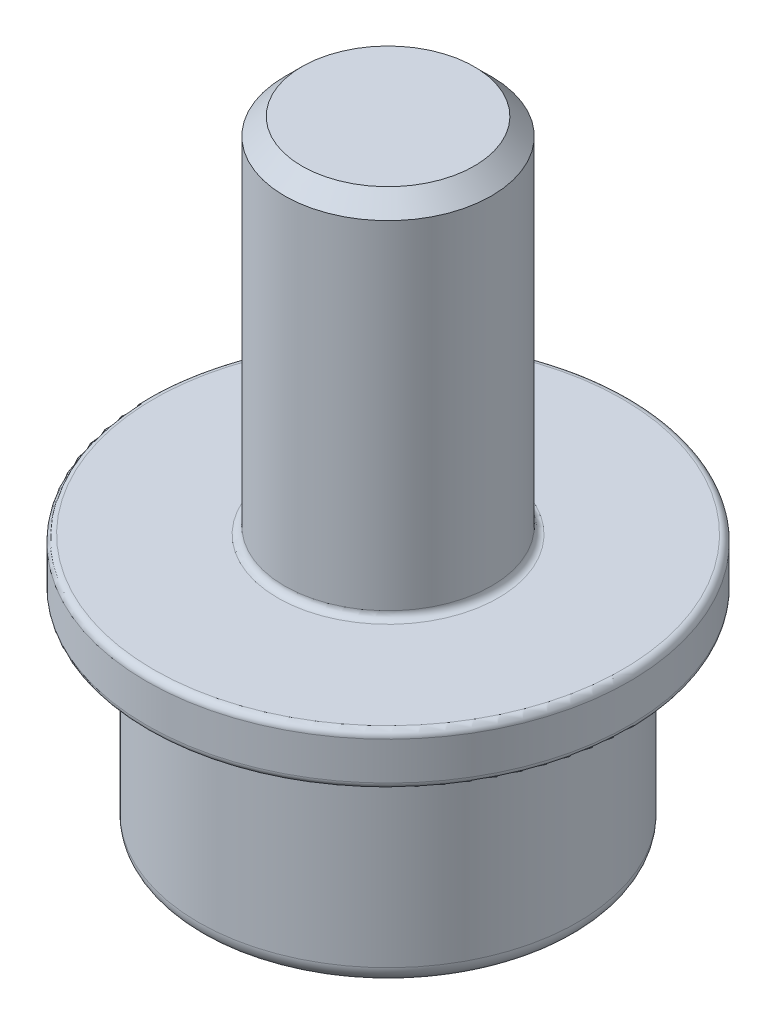
ISO-10303-21;
HEADER;
FILE_DESCRIPTION(('STEP AP214'),'2;1');
FILE_NAME('part.step','',(''),(''),'','','');
FILE_SCHEMA(('AUTOMOTIVE_DESIGN { 1 0 10303 214 1 1 1 1 }'));
ENDSEC;
DATA;
#1=APPLICATION_CONTEXT('core data for automotive mechanical design processes');
#2=APPLICATION_PROTOCOL_DEFINITION('international standard','automotive_design',2000,#1);
#3=PRODUCT_CONTEXT('',#1,'mechanical');
#4=PRODUCT('Part','Part','',(#3));
#5=PRODUCT_RELATED_PRODUCT_CATEGORY('part','',(#4));
#6=PRODUCT_DEFINITION_FORMATION('','',#4);
#7=PRODUCT_DEFINITION_CONTEXT('part definition',#1,'design');
#8=PRODUCT_DEFINITION('design','',#6,#7);
#9=PRODUCT_DEFINITION_SHAPE('','',#8);
#10=(LENGTH_UNIT() NAMED_UNIT(*) SI_UNIT(.MILLI.,.METRE.));
#11=(NAMED_UNIT(*) PLANE_ANGLE_UNIT() SI_UNIT($,.RADIAN.));
#12=(NAMED_UNIT(*) SI_UNIT($,.STERADIAN.) SOLID_ANGLE_UNIT());
#13=UNCERTAINTY_MEASURE_WITH_UNIT(LENGTH_MEASURE(1.E-05),#10,'distance_accuracy_value','');
#14=(GEOMETRIC_REPRESENTATION_CONTEXT(3) GLOBAL_UNCERTAINTY_ASSIGNED_CONTEXT((#13)) GLOBAL_UNIT_ASSIGNED_CONTEXT((#10,
#11,#12)) REPRESENTATION_CONTEXT('',''));
#15=CARTESIAN_POINT('',(0.,0.,0.));
#16=DIRECTION('',(0.,0.,1.));
#17=DIRECTION('',(1.,0.,0.));
#18=AXIS2_PLACEMENT_3D('',#15,#16,#17);
#19=CARTESIAN_POINT('',(0.,3.,0.));
#20=DIRECTION('',(0.,-1.,0.));
#21=DIRECTION('',(0.,0.,-1.));
#22=AXIS2_PLACEMENT_3D('',#19,#20,#21);
#23=CYLINDRICAL_SURFACE('',#22,2.75);
#24=CARTESIAN_POINT('',(0.,2.9,0.));
#25=DIRECTION('',(0.,1.,0.));
#26=DIRECTION('',(0.,0.,1.));
#27=AXIS2_PLACEMENT_3D('',#24,#25,#26);
#28=CIRCLE('',#27,2.75);
#29=CARTESIAN_POINT('',(0.,2.9,2.75));
#30=VERTEX_POINT('',#29);
#31=EDGE_CURVE('E201',#30,#30,#28,.F.);
#32=ORIENTED_EDGE('',*,*,#31,.T.);
#33=EDGE_LOOP('',(#32));
#34=FACE_BOUND('',#33,.T.);
#35=CARTESIAN_POINT('',(0.,0.25,0.));
#36=DIRECTION('',(0.,1.,0.));
#37=DIRECTION('',(0.,0.,1.));
#38=AXIS2_PLACEMENT_3D('',#35,#36,#37);
#39=CIRCLE('',#38,2.75);
#40=CARTESIAN_POINT('',(0.,0.25,2.75));
#41=VERTEX_POINT('',#40);
#42=EDGE_CURVE('E174',#41,#41,#39,.T.);
#43=ORIENTED_EDGE('',*,*,#42,.T.);
#44=EDGE_LOOP('',(#43));
#45=FACE_BOUND('',#44,.T.);
#46=ADVANCED_FACE('F33',(#34,#45),#23,.T.);
#47=CARTESIAN_POINT('',(0.,0.,0.));
#48=DIRECTION('',(0.,1.,0.));
#49=DIRECTION('',(0.,0.,1.));
#50=AXIS2_PLACEMENT_3D('',#47,#48,#49);
#51=PLANE('',#50);
#52=CARTESIAN_POINT('',(0.,0.,0.));
#53=DIRECTION('',(0.,1.,0.));
#54=DIRECTION('',(0.,0.,1.));
#55=AXIS2_PLACEMENT_3D('',#52,#53,#54);
#56=CIRCLE('',#55,2.5);
#57=CARTESIAN_POINT('',(0.,0.,2.5));
#58=VERTEX_POINT('',#57);
#59=EDGE_CURVE('E189',#58,#58,#56,.F.);
#60=ORIENTED_EDGE('',*,*,#59,.T.);
#61=EDGE_LOOP('',(#60));
#62=FACE_BOUND('',#61,.T.);
#63=DIRECTION('',(-0.69197693122312,0.,-0.721919612321922));
#64=VECTOR('',#63,1.);
#65=CARTESIAN_POINT('',(1.02450088015783,0.,-0.982008194523007));
#66=LINE('',#65,#64);
#67=CARTESIAN_POINT('',(1.59146357561211,0.,-0.390512335578876));
#68=VERTEX_POINT('',#67);
#69=CARTESIAN_POINT('',(0.457538184703553,0.,-1.57350405346714));
#70=VERTEX_POINT('',#69);
#71=EDGE_CURVE('E153',#68,#70,#66,.T.);
#72=ORIENTED_EDGE('',*,*,#71,.T.);
#73=DIRECTION('',(-0.971189189372558,0.,0.238309795111058));
#74=VECTOR('',#73,1.);
#75=CARTESIAN_POINT('',(-0.3381936031025,0.,-1.3782478856777));
#76=LINE('',#75,#74);
#77=CARTESIAN_POINT('',(-1.13392539090855,0.,-1.18299171788826));
#78=VERTEX_POINT('',#77);
#79=EDGE_CURVE('E163',#70,#78,#76,.T.);
#80=ORIENTED_EDGE('',*,*,#79,.T.);
#81=DIRECTION('',(-0.279212258149438,0.,0.96022940743298));
#82=VECTOR('',#81,1.);
#83=CARTESIAN_POINT('',(-1.36269448326033,0.,-0.396239691154693));
#84=LINE('',#83,#82);
#85=CARTESIAN_POINT('',(-1.5914635756121,0.,0.390512335578876));
#86=VERTEX_POINT('',#85);
#87=EDGE_CURVE('E161',#78,#86,#84,.T.);
#88=ORIENTED_EDGE('',*,*,#87,.T.);
#89=DIRECTION('',(0.69197693122312,0.,0.721919612321922));
#90=VECTOR('',#89,1.);
#91=CARTESIAN_POINT('',(-1.02450088015783,0.,0.982008194523007));
#92=LINE('',#91,#90);
#93=CARTESIAN_POINT('',(-0.457538184703552,0.,1.57350405346714));
#94=VERTEX_POINT('',#93);
#95=EDGE_CURVE('E159',#86,#94,#92,.T.);
#96=ORIENTED_EDGE('',*,*,#95,.T.);
#97=DIRECTION('',(0.971189189372558,0.,-0.238309795111058));
#98=VECTOR('',#97,1.);
#99=CARTESIAN_POINT('',(0.3381936031025,0.,1.3782478856777));
#100=LINE('',#99,#98);
#101=CARTESIAN_POINT('',(1.13392539090855,0.,1.18299171788826));
#102=VERTEX_POINT('',#101);
#103=EDGE_CURVE('E157',#94,#102,#100,.T.);
#104=ORIENTED_EDGE('',*,*,#103,.T.);
#105=DIRECTION('',(0.279212258149438,0.,-0.96022940743298));
#106=VECTOR('',#105,1.);
#107=CARTESIAN_POINT('',(1.36269448326033,0.,0.396239691154693));
#108=LINE('',#107,#106);
#109=EDGE_CURVE('E155',#102,#68,#108,.T.);
#110=ORIENTED_EDGE('',*,*,#109,.T.);
#111=EDGE_LOOP('',(#72,#80,#88,#96,#104,#110));
#112=FACE_BOUND('',#111,.T.);
#113=ADVANCED_FACE('F243',(#62,#112),#51,.F.);
#114=CARTESIAN_POINT('',(1.31110540565295,1.5,-0.321718223399928));
#115=DIRECTION('',(0.96022940743298,0.,0.279212258149438));
#116=DIRECTION('',(0.279212258149438,0.,-0.96022940743298));
#117=AXIS2_PLACEMENT_3D('',#114,#115,#116);
#118=PLANE('',#117);
#119=DIRECTION('',(0.,-1.,0.));
#120=VECTOR('',#119,1.);
#121=CARTESIAN_POINT('',(1.31110540565295,1.5,-0.321718223399928));
#122=LINE('',#121,#120);
#123=CARTESIAN_POINT('',(1.31110540565295,1.5,-0.321718223399928));
#124=VERTEX_POINT('',#123);
#125=CARTESIAN_POINT('',(1.31110540565295,0.250000000000002,-0.321718223399928));
#126=VERTEX_POINT('',#125);
#127=EDGE_CURVE('E139',#124,#126,#122,.T.);
#128=ORIENTED_EDGE('',*,*,#127,.T.);
#129=DIRECTION('',(-0.279212258149438,0.,0.96022940743298));
#130=VECTOR('',#129,1.);
#131=CARTESIAN_POINT('',(1.31110540565295,0.250000000000002,-0.321718223399928));
#132=LINE('',#131,#130);
#133=CARTESIAN_POINT('',(0.934168857151212,0.250000000000002,0.974591476634595));
#134=VERTEX_POINT('',#133);
#135=EDGE_CURVE('E55',#126,#134,#132,.T.);
#136=ORIENTED_EDGE('',*,*,#135,.T.);
#137=DIRECTION('',(0.,-1.,0.));
#138=VECTOR('',#137,1.);
#139=CARTESIAN_POINT('',(0.934168857151212,1.5,0.974591476634595));
#140=LINE('',#139,#138);
#141=CARTESIAN_POINT('',(0.934168857151212,1.5,0.974591476634595));
#142=VERTEX_POINT('',#141);
#143=EDGE_CURVE('E103',#142,#134,#140,.T.);
#144=ORIENTED_EDGE('',*,*,#143,.F.);
#145=DIRECTION('',(-0.279212258149438,0.,0.96022940743298));
#146=VECTOR('',#145,1.);
#147=CARTESIAN_POINT('',(1.31110540565295,1.5,-0.321718223399928));
#148=LINE('',#147,#146);
#149=EDGE_CURVE('E107',#124,#142,#148,.T.);
#150=ORIENTED_EDGE('',*,*,#149,.F.);
#151=EDGE_LOOP('',(#128,#136,#144,#150));
#152=FACE_BOUND('',#151,.T.);
#153=ADVANCED_FACE('F105',(#152),#118,.F.);
#154=CARTESIAN_POINT('',(0.376936548501741,1.5,-1.29630970003452));
#155=DIRECTION('',(0.721919612321922,0.,-0.69197693122312));
#156=DIRECTION('',(-0.69197693122312,0.,-0.721919612321922));
#157=AXIS2_PLACEMENT_3D('',#154,#155,#156);
#158=PLANE('',#157);
#159=DIRECTION('',(0.,-1.,0.));
#160=VECTOR('',#159,1.);
#161=CARTESIAN_POINT('',(0.376936548501741,1.5,-1.29630970003452));
#162=LINE('',#161,#160);
#163=CARTESIAN_POINT('',(0.376936548501741,1.5,-1.29630970003452));
#164=VERTEX_POINT('',#163);
#165=CARTESIAN_POINT('',(0.376936548501741,0.250000000000002,-1.29630970003452));
#166=VERTEX_POINT('',#165);
#167=EDGE_CURVE('E142',#164,#166,#162,.T.);
#168=ORIENTED_EDGE('',*,*,#167,.T.);
#169=DIRECTION('',(0.69197693122312,0.,0.721919612321922));
#170=VECTOR('',#169,1.);
#171=CARTESIAN_POINT('',(0.376936548501741,0.250000000000002,-1.29630970003452));
#172=LINE('',#171,#170);
#173=EDGE_CURVE('E48',#166,#126,#172,.T.);
#174=ORIENTED_EDGE('',*,*,#173,.T.);
#175=ORIENTED_EDGE('',*,*,#127,.F.);
#176=DIRECTION('',(0.69197693122312,0.,0.721919612321922));
#177=VECTOR('',#176,1.);
#178=CARTESIAN_POINT('',(0.376936548501741,1.5,-1.29630970003452));
#179=LINE('',#178,#177);
#180=EDGE_CURVE('E112',#164,#124,#179,.T.);
#181=ORIENTED_EDGE('',*,*,#180,.F.);
#182=EDGE_LOOP('',(#168,#174,#175,#181));
#183=FACE_BOUND('',#182,.T.);
#184=ADVANCED_FACE('F311',(#183),#158,.F.);
#185=CARTESIAN_POINT('',(-0.934168857151211,1.5,-0.974591476634595));
#186=DIRECTION('',(-0.238309795111058,0.,-0.971189189372557));
#187=DIRECTION('',(-0.971189189372558,0.,0.238309795111058));
#188=AXIS2_PLACEMENT_3D('',#185,#186,#187);
#189=PLANE('',#188);
#190=DIRECTION('',(0.,-1.,0.));
#191=VECTOR('',#190,1.);
#192=CARTESIAN_POINT('',(-0.934168857151211,1.5,-0.974591476634595));
#193=LINE('',#192,#191);
#194=CARTESIAN_POINT('',(-0.934168857151211,1.5,-0.974591476634595));
#195=VERTEX_POINT('',#194);
#196=CARTESIAN_POINT('',(-0.934168857151211,0.250000000000002,-0.974591476634595));
#197=VERTEX_POINT('',#196);
#198=EDGE_CURVE('E144',#195,#197,#193,.T.);
#199=ORIENTED_EDGE('',*,*,#198,.T.);
#200=DIRECTION('',(0.971189189372558,0.,-0.238309795111058));
#201=VECTOR('',#200,1.);
#202=CARTESIAN_POINT('',(-0.934168857151211,0.250000000000002,-0.974591476634595));
#203=LINE('',#202,#201);
#204=EDGE_CURVE('E141',#197,#166,#203,.T.);
#205=ORIENTED_EDGE('',*,*,#204,.T.);
#206=ORIENTED_EDGE('',*,*,#167,.F.);
#207=DIRECTION('',(0.971189189372558,0.,-0.238309795111058));
#208=VECTOR('',#207,1.);
#209=CARTESIAN_POINT('',(-0.934168857151211,1.5,-0.974591476634595));
#210=LINE('',#209,#208);
#211=EDGE_CURVE('E136',#195,#164,#210,.T.);
#212=ORIENTED_EDGE('',*,*,#211,.F.);
#213=EDGE_LOOP('',(#199,#205,#206,#212));
#214=FACE_BOUND('',#213,.T.);
#215=ADVANCED_FACE('F321',(#214),#189,.F.);
#216=CARTESIAN_POINT('',(-1.31110540565295,1.5,0.321718223399928));
#217=DIRECTION('',(-0.96022940743298,0.,-0.279212258149438));
#218=DIRECTION('',(-0.279212258149438,0.,0.96022940743298));
#219=AXIS2_PLACEMENT_3D('',#216,#217,#218);
#220=PLANE('',#219);
#221=DIRECTION('',(0.,-1.,0.));
#222=VECTOR('',#221,1.);
#223=CARTESIAN_POINT('',(-1.31110540565295,1.5,0.321718223399928));
#224=LINE('',#223,#222);
#225=CARTESIAN_POINT('',(-1.31110540565295,1.5,0.321718223399928));
#226=VERTEX_POINT('',#225);
#227=CARTESIAN_POINT('',(-1.31110540565295,0.250000000000002,0.321718223399928));
#228=VERTEX_POINT('',#227);
#229=EDGE_CURVE('E147',#226,#228,#224,.T.);
#230=ORIENTED_EDGE('',*,*,#229,.T.);
#231=DIRECTION('',(0.279212258149438,0.,-0.96022940743298));
#232=VECTOR('',#231,1.);
#233=CARTESIAN_POINT('',(-1.31110540565295,0.250000000000002,0.321718223399928));
#234=LINE('',#233,#232);
#235=EDGE_CURVE('E166',#228,#197,#234,.T.);
#236=ORIENTED_EDGE('',*,*,#235,.T.);
#237=ORIENTED_EDGE('',*,*,#198,.F.);
#238=DIRECTION('',(0.279212258149438,0.,-0.96022940743298));
#239=VECTOR('',#238,1.);
#240=CARTESIAN_POINT('',(-1.31110540565295,1.5,0.321718223399928));
#241=LINE('',#240,#239);
#242=EDGE_CURVE('E133',#226,#195,#241,.T.);
#243=ORIENTED_EDGE('',*,*,#242,.F.);
#244=EDGE_LOOP('',(#230,#236,#237,#243));
#245=FACE_BOUND('',#244,.T.);
#246=ADVANCED_FACE('F317',(#245),#220,.F.);
#247=CARTESIAN_POINT('',(-0.376936548501741,1.5,1.29630970003452));
#248=DIRECTION('',(-0.721919612321922,0.,0.69197693122312));
#249=DIRECTION('',(0.69197693122312,0.,0.721919612321922));
#250=AXIS2_PLACEMENT_3D('',#247,#248,#249);
#251=PLANE('',#250);
#252=DIRECTION('',(0.,-1.,0.));
#253=VECTOR('',#252,1.);
#254=CARTESIAN_POINT('',(-0.376936548501741,1.5,1.29630970003452));
#255=LINE('',#254,#253);
#256=CARTESIAN_POINT('',(-0.376936548501741,1.5,1.29630970003452));
#257=VERTEX_POINT('',#256);
#258=CARTESIAN_POINT('',(-0.376936548501741,0.250000000000002,1.29630970003452));
#259=VERTEX_POINT('',#258);
#260=EDGE_CURVE('E111',#257,#259,#255,.T.);
#261=ORIENTED_EDGE('',*,*,#260,.T.);
#262=DIRECTION('',(-0.69197693122312,0.,-0.721919612321922));
#263=VECTOR('',#262,1.);
#264=CARTESIAN_POINT('',(-0.376936548501741,0.250000000000002,1.29630970003452));
#265=LINE('',#264,#263);
#266=EDGE_CURVE('E168',#259,#228,#265,.T.);
#267=ORIENTED_EDGE('',*,*,#266,.T.);
#268=ORIENTED_EDGE('',*,*,#229,.F.);
#269=DIRECTION('',(-0.69197693122312,0.,-0.721919612321922));
#270=VECTOR('',#269,1.);
#271=CARTESIAN_POINT('',(-0.376936548501741,1.5,1.29630970003452));
#272=LINE('',#271,#270);
#273=EDGE_CURVE('E121',#257,#226,#272,.T.);
#274=ORIENTED_EDGE('',*,*,#273,.F.);
#275=EDGE_LOOP('',(#261,#267,#268,#274));
#276=FACE_BOUND('',#275,.T.);
#277=ADVANCED_FACE('F314',(#276),#251,.F.);
#278=CARTESIAN_POINT('',(0.934168857151212,1.5,0.974591476634595));
#279=DIRECTION('',(0.238309795111058,0.,0.971189189372558));
#280=DIRECTION('',(0.971189189372558,0.,-0.238309795111058));
#281=AXIS2_PLACEMENT_3D('',#278,#279,#280);
#282=PLANE('',#281);
#283=ORIENTED_EDGE('',*,*,#143,.T.);
#284=DIRECTION('',(-0.971189189372558,0.,0.238309795111058));
#285=VECTOR('',#284,1.);
#286=CARTESIAN_POINT('',(0.934168857151212,0.250000000000002,0.974591476634595));
#287=LINE('',#286,#285);
#288=EDGE_CURVE('E170',#134,#259,#287,.T.);
#289=ORIENTED_EDGE('',*,*,#288,.T.);
#290=ORIENTED_EDGE('',*,*,#260,.F.);
#291=DIRECTION('',(-0.971189189372557,0.,0.238309795111058));
#292=VECTOR('',#291,1.);
#293=CARTESIAN_POINT('',(0.934168857151212,1.5,0.974591476634595));
#294=LINE('',#293,#292);
#295=EDGE_CURVE('E115',#142,#257,#294,.T.);
#296=ORIENTED_EDGE('',*,*,#295,.F.);
#297=EDGE_LOOP('',(#283,#289,#290,#296));
#298=FACE_BOUND('',#297,.T.);
#299=ADVANCED_FACE('F116',(#298),#282,.F.);
#300=CARTESIAN_POINT('',(0.,1.5,0.));
#301=DIRECTION('',(0.,-1.,0.));
#302=DIRECTION('',(0.,0.,-1.));
#303=AXIS2_PLACEMENT_3D('',#300,#301,#302);
#304=PLANE('',#303);
#305=ORIENTED_EDGE('',*,*,#149,.T.);
#306=ORIENTED_EDGE('',*,*,#295,.T.);
#307=ORIENTED_EDGE('',*,*,#273,.T.);
#308=ORIENTED_EDGE('',*,*,#242,.T.);
#309=ORIENTED_EDGE('',*,*,#211,.T.);
#310=ORIENTED_EDGE('',*,*,#180,.T.);
#311=EDGE_LOOP('',(#305,#306,#307,#308,#309,#310));
#312=FACE_BOUND('',#311,.T.);
#313=ADVANCED_FACE('F123',(#312),#304,.T.);
#314=CARTESIAN_POINT('',(0.934168857151212,0.250000000000002,0.974591476634595));
#315=DIRECTION('',(0.168510472146206,0.707106781186547,0.686734461620402));
#316=DIRECTION('',(-0.971189189372558,0.,0.238309795111058));
#317=AXIS2_PLACEMENT_3D('',#314,#315,#316);
#318=PLANE('',#317);
#319=DIRECTION('',(-0.523085392288577,0.654653670707978,-0.545719931652561));
#320=VECTOR('',#319,1.);
#321=CARTESIAN_POINT('',(0.934168857151212,0.250000000000002,0.974591476634595));
#322=LINE('',#321,#320);
#323=EDGE_CURVE('E129',#102,#134,#322,.T.);
#324=ORIENTED_EDGE('',*,*,#323,.F.);
#325=ORIENTED_EDGE('',*,*,#103,.F.);
#326=DIRECTION('',(0.211064628018337,0.654653670707978,-0.725865203896737));
#327=VECTOR('',#326,1.);
#328=CARTESIAN_POINT('',(-0.376936548501741,0.250000000000002,1.29630970003452));
#329=LINE('',#328,#327);
#330=EDGE_CURVE('E126',#259,#94,#329,.F.);
#331=ORIENTED_EDGE('',*,*,#330,.F.);
#332=ORIENTED_EDGE('',*,*,#288,.F.);
#333=EDGE_LOOP('',(#324,#325,#331,#332));
#334=FACE_BOUND('',#333,.T.);
#335=ADVANCED_FACE('F273',(#334),#318,.F.);
#336=CARTESIAN_POINT('',(-0.376936548501741,0.250000000000002,1.29630970003452));
#337=DIRECTION('',(-0.510474253344395,0.707106781186547,0.489301580492525));
#338=DIRECTION('',(-0.69197693122312,0.,-0.721919612321922));
#339=AXIS2_PLACEMENT_3D('',#336,#337,#338);
#340=PLANE('',#339);
#341=ORIENTED_EDGE('',*,*,#330,.T.);
#342=ORIENTED_EDGE('',*,*,#95,.F.);
#343=DIRECTION('',(0.734150020306914,0.654653670707978,-0.180145272244176));
#344=VECTOR('',#343,1.);
#345=CARTESIAN_POINT('',(-1.31110540565295,0.250000000000002,0.321718223399928));
#346=LINE('',#345,#344);
#347=EDGE_CURVE('E182',#228,#86,#346,.F.);
#348=ORIENTED_EDGE('',*,*,#347,.F.);
#349=ORIENTED_EDGE('',*,*,#266,.F.);
#350=EDGE_LOOP('',(#341,#342,#348,#349));
#351=FACE_BOUND('',#350,.T.);
#352=ADVANCED_FACE('F269',(#351),#340,.F.);
#353=CARTESIAN_POINT('',(1.31110540565295,0.250000000000002,-0.321718223399928));
#354=DIRECTION('',(0.678984725490601,0.707106781186547,0.197432881127877));
#355=DIRECTION('',(-0.279212258149438,0.,0.96022940743298));
#356=AXIS2_PLACEMENT_3D('',#353,#354,#355);
#357=PLANE('',#356);
#358=ORIENTED_EDGE('',*,*,#323,.T.);
#359=ORIENTED_EDGE('',*,*,#135,.F.);
#360=DIRECTION('',(-0.734150020306914,0.654653670707978,0.180145272244176));
#361=VECTOR('',#360,1.);
#362=CARTESIAN_POINT('',(1.31110540565295,0.250000000000002,-0.321718223399928));
#363=LINE('',#362,#361);
#364=EDGE_CURVE('E179',#68,#126,#363,.T.);
#365=ORIENTED_EDGE('',*,*,#364,.F.);
#366=ORIENTED_EDGE('',*,*,#109,.F.);
#367=EDGE_LOOP('',(#358,#359,#365,#366));
#368=FACE_BOUND('',#367,.T.);
#369=ADVANCED_FACE('F265',(#368),#357,.F.);
#370=CARTESIAN_POINT('',(-1.31110540565295,0.250000000000002,0.321718223399928));
#371=DIRECTION('',(-0.678984725490601,0.707106781186547,-0.197432881127877));
#372=DIRECTION('',(0.279212258149438,0.,-0.96022940743298));
#373=AXIS2_PLACEMENT_3D('',#370,#371,#372);
#374=PLANE('',#373);
#375=ORIENTED_EDGE('',*,*,#347,.T.);
#376=ORIENTED_EDGE('',*,*,#87,.F.);
#377=DIRECTION('',(0.523085392288577,0.654653670707978,0.545719931652561));
#378=VECTOR('',#377,1.);
#379=CARTESIAN_POINT('',(-0.934168857151211,0.250000000000002,-0.974591476634595));
#380=LINE('',#379,#378);
#381=EDGE_CURVE('E177',#197,#78,#380,.F.);
#382=ORIENTED_EDGE('',*,*,#381,.F.);
#383=ORIENTED_EDGE('',*,*,#235,.F.);
#384=EDGE_LOOP('',(#375,#376,#382,#383));
#385=FACE_BOUND('',#384,.T.);
#386=ADVANCED_FACE('F261',(#385),#374,.F.);
#387=CARTESIAN_POINT('',(0.376936548501741,0.250000000000002,-1.29630970003452));
#388=DIRECTION('',(0.510474253344395,0.707106781186547,-0.489301580492525));
#389=DIRECTION('',(0.69197693122312,0.,0.721919612321922));
#390=AXIS2_PLACEMENT_3D('',#387,#388,#389);
#391=PLANE('',#390);
#392=ORIENTED_EDGE('',*,*,#364,.T.);
#393=ORIENTED_EDGE('',*,*,#173,.F.);
#394=DIRECTION('',(0.211064628018338,-0.654653670707978,-0.725865203896737));
#395=VECTOR('',#394,1.);
#396=CARTESIAN_POINT('',(0.269240391786958,0.584038370031143,-0.92593550002466));
#397=LINE('',#396,#395);
#398=EDGE_CURVE('E175',#70,#166,#397,.F.);
#399=ORIENTED_EDGE('',*,*,#398,.F.);
#400=ORIENTED_EDGE('',*,*,#71,.F.);
#401=EDGE_LOOP('',(#392,#393,#399,#400));
#402=FACE_BOUND('',#401,.T.);
#403=ADVANCED_FACE('F257',(#402),#391,.F.);
#404=CARTESIAN_POINT('',(-0.934168857151211,0.250000000000002,-0.974591476634595));
#405=DIRECTION('',(-0.168510472146206,0.707106781186547,-0.686734461620402));
#406=DIRECTION('',(0.971189189372558,0.,-0.238309795111058));
#407=AXIS2_PLACEMENT_3D('',#404,#405,#406);
#408=PLANE('',#407);
#409=ORIENTED_EDGE('',*,*,#381,.T.);
#410=ORIENTED_EDGE('',*,*,#79,.F.);
#411=ORIENTED_EDGE('',*,*,#398,.T.);
#412=ORIENTED_EDGE('',*,*,#204,.F.);
#413=EDGE_LOOP('',(#409,#410,#411,#412));
#414=FACE_BOUND('',#413,.T.);
#415=ADVANCED_FACE('F254',(#414),#408,.F.);
#416=CARTESIAN_POINT('',(0.,0.25,0.));
#417=DIRECTION('',(0.,1.,0.));
#418=DIRECTION('',(0.,0.,1.));
#419=AXIS2_PLACEMENT_3D('',#416,#417,#418);
#420=TOROIDAL_SURFACE('',#419,2.5,0.25);
#421=ORIENTED_EDGE('',*,*,#59,.F.);
#422=EDGE_LOOP('',(#421));
#423=FACE_BOUND('',#422,.T.);
#424=ORIENTED_EDGE('',*,*,#42,.F.);
#425=EDGE_LOOP('',(#424));
#426=FACE_BOUND('',#425,.T.);
#427=ADVANCED_FACE('F239',(#423,#426),#420,.T.);
#428=CARTESIAN_POINT('',(0.,2.9,0.));
#429=DIRECTION('',(0.,1.,0.));
#430=DIRECTION('',(0.,0.,1.));
#431=AXIS2_PLACEMENT_3D('',#428,#429,#430);
#432=TOROIDAL_SURFACE('',#431,2.65,0.1);
#433=ORIENTED_EDGE('',*,*,#31,.F.);
#434=EDGE_LOOP('',(#433));
#435=FACE_BOUND('',#434,.T.);
#436=CARTESIAN_POINT('',(0.,3.,0.));
#437=DIRECTION('',(0.,1.,0.));
#438=DIRECTION('',(0.,0.,1.));
#439=AXIS2_PLACEMENT_3D('',#436,#437,#438);
#440=CIRCLE('',#439,2.65);
#441=CARTESIAN_POINT('',(0.,3.,2.65));
#442=VERTEX_POINT('',#441);
#443=EDGE_CURVE('E198',#442,#442,#440,.T.);
#444=ORIENTED_EDGE('',*,*,#443,.F.);
#445=EDGE_LOOP('',(#444));
#446=FACE_BOUND('',#445,.T.);
#447=ADVANCED_FACE('F230',(#435,#446),#432,.T.);
#448=CARTESIAN_POINT('',(0.,3.75,0.));
#449=DIRECTION('',(0.,1.,0.));
#450=DIRECTION('',(0.,0.,1.));
#451=AXIS2_PLACEMENT_3D('',#448,#449,#450);
#452=PLANE('',#451);
#453=CARTESIAN_POINT('',(0.,3.75,0.));
#454=DIRECTION('',(0.,1.,0.));
#455=DIRECTION('',(0.,0.,1.));
#456=AXIS2_PLACEMENT_3D('',#453,#454,#455);
#457=CIRCLE('',#456,1.6);
#458=CARTESIAN_POINT('',(0.,3.75,1.6));
#459=VERTEX_POINT('',#458);
#460=EDGE_CURVE('E210',#459,#459,#457,.F.);
#461=ORIENTED_EDGE('',*,*,#460,.T.);
#462=EDGE_LOOP('',(#461));
#463=FACE_BOUND('',#462,.T.);
#464=CARTESIAN_POINT('',(0.,3.75,0.));
#465=DIRECTION('',(0.,1.,0.));
#466=DIRECTION('',(0.,0.,1.));
#467=AXIS2_PLACEMENT_3D('',#464,#465,#466);
#468=CIRCLE('',#467,3.4);
#469=CARTESIAN_POINT('',(0.,3.75,3.4));
#470=VERTEX_POINT('',#469);
#471=EDGE_CURVE('E207',#470,#470,#468,.T.);
#472=ORIENTED_EDGE('',*,*,#471,.T.);
#473=EDGE_LOOP('',(#472));
#474=FACE_BOUND('',#473,.T.);
#475=ADVANCED_FACE('F227',(#463,#474),#452,.T.);
#476=CARTESIAN_POINT('',(0.,3.,0.));
#477=DIRECTION('',(0.,1.,0.));
#478=DIRECTION('',(0.,0.,1.));
#479=AXIS2_PLACEMENT_3D('',#476,#477,#478);
#480=PLANE('',#479);
#481=CARTESIAN_POINT('',(0.,3.,0.));
#482=DIRECTION('',(0.,1.,0.));
#483=DIRECTION('',(0.,0.,1.));
#484=AXIS2_PLACEMENT_3D('',#481,#482,#483);
#485=CIRCLE('',#484,3.4);
#486=CARTESIAN_POINT('',(0.,3.,3.4));
#487=VERTEX_POINT('',#486);
#488=EDGE_CURVE('E11',#487,#487,#485,.F.);
#489=ORIENTED_EDGE('',*,*,#488,.T.);
#490=EDGE_LOOP('',(#489));
#491=FACE_BOUND('',#490,.T.);
#492=ORIENTED_EDGE('',*,*,#443,.T.);
#493=EDGE_LOOP('',(#492));
#494=FACE_BOUND('',#493,.T.);
#495=ADVANCED_FACE('F229',(#491,#494),#480,.F.);
#496=CARTESIAN_POINT('',(0.,3.75,0.));
#497=DIRECTION('',(0.,-1.,0.));
#498=DIRECTION('',(0.,0.,-1.));
#499=AXIS2_PLACEMENT_3D('',#496,#497,#498);
#500=CYLINDRICAL_SURFACE('',#499,3.5);
#501=CARTESIAN_POINT('',(0.,3.65,0.));
#502=DIRECTION('',(0.,1.,0.));
#503=DIRECTION('',(0.,0.,1.));
#504=AXIS2_PLACEMENT_3D('',#501,#502,#503);
#505=CIRCLE('',#504,3.5);
#506=CARTESIAN_POINT('',(0.,3.65,3.5));
#507=VERTEX_POINT('',#506);
#508=EDGE_CURVE('E41',#507,#507,#505,.F.);
#509=ORIENTED_EDGE('',*,*,#508,.T.);
#510=EDGE_LOOP('',(#509));
#511=FACE_BOUND('',#510,.T.);
#512=CARTESIAN_POINT('',(0.,3.1,0.));
#513=DIRECTION('',(0.,1.,0.));
#514=DIRECTION('',(0.,0.,1.));
#515=AXIS2_PLACEMENT_3D('',#512,#513,#514);
#516=CIRCLE('',#515,3.5);
#517=CARTESIAN_POINT('',(0.,3.1,3.5));
#518=VERTEX_POINT('',#517);
#519=EDGE_CURVE('E213',#518,#518,#516,.T.);
#520=ORIENTED_EDGE('',*,*,#519,.T.);
#521=EDGE_LOOP('',(#520));
#522=FACE_BOUND('',#521,.T.);
#523=ADVANCED_FACE('F218',(#511,#522),#500,.T.);
#524=CARTESIAN_POINT('',(0.,9.,0.));
#525=DIRECTION('',(0.,1.,0.));
#526=DIRECTION('',(0.,0.,1.));
#527=AXIS2_PLACEMENT_3D('',#524,#525,#526);
#528=PLANE('',#527);
#529=CARTESIAN_POINT('',(0.,9.,0.));
#530=DIRECTION('',(0.,1.,0.));
#531=DIRECTION('',(0.,0.,1.));
#532=AXIS2_PLACEMENT_3D('',#529,#530,#531);
#533=CIRCLE('',#532,1.25);
#534=CARTESIAN_POINT('',(0.,9.,1.25));
#535=VERTEX_POINT('',#534);
#536=EDGE_CURVE('E192',#535,#535,#533,.T.);
#537=ORIENTED_EDGE('',*,*,#536,.T.);
#538=EDGE_LOOP('',(#537));
#539=FACE_BOUND('',#538,.T.);
#540=ADVANCED_FACE('F284',(#539),#528,.T.);
#541=CARTESIAN_POINT('',(0.,9.,0.));
#542=DIRECTION('',(0.,-1.,0.));
#543=DIRECTION('',(0.,0.,-1.));
#544=AXIS2_PLACEMENT_3D('',#541,#542,#543);
#545=CONICAL_SURFACE('',#544,1.25,0.785398163397443);
#546=CARTESIAN_POINT('',(0.,8.75,0.));
#547=DIRECTION('',(0.,1.,0.));
#548=DIRECTION('',(0.,0.,1.));
#549=AXIS2_PLACEMENT_3D('',#546,#547,#548);
#550=CIRCLE('',#549,1.5);
#551=CARTESIAN_POINT('',(0.,8.75,1.5));
#552=VERTEX_POINT('',#551);
#553=EDGE_CURVE('E195',#552,#552,#550,.F.);
#554=ORIENTED_EDGE('',*,*,#553,.F.);
#555=EDGE_LOOP('',(#554));
#556=FACE_BOUND('',#555,.T.);
#557=ORIENTED_EDGE('',*,*,#536,.F.);
#558=EDGE_LOOP('',(#557));
#559=FACE_BOUND('',#558,.T.);
#560=ADVANCED_FACE('F281',(#556,#559),#545,.T.);
#561=CARTESIAN_POINT('',(0.,9.,0.));
#562=DIRECTION('',(0.,-1.,0.));
#563=DIRECTION('',(0.,0.,-1.));
#564=AXIS2_PLACEMENT_3D('',#561,#562,#563);
#565=CYLINDRICAL_SURFACE('',#564,1.5);
#566=CARTESIAN_POINT('',(0.,3.85,0.));
#567=DIRECTION('',(0.,1.,0.));
#568=DIRECTION('',(0.,0.,1.));
#569=AXIS2_PLACEMENT_3D('',#566,#567,#568);
#570=CIRCLE('',#569,1.5);
#571=CARTESIAN_POINT('',(0.,3.85,1.5));
#572=VERTEX_POINT('',#571);
#573=EDGE_CURVE('E204',#572,#572,#570,.T.);
#574=ORIENTED_EDGE('',*,*,#573,.T.);
#575=EDGE_LOOP('',(#574));
#576=FACE_BOUND('',#575,.T.);
#577=ORIENTED_EDGE('',*,*,#553,.T.);
#578=EDGE_LOOP('',(#577));
#579=FACE_BOUND('',#578,.T.);
#580=ADVANCED_FACE('F283',(#576,#579),#565,.T.);
#581=CARTESIAN_POINT('',(0.,3.85,0.));
#582=DIRECTION('',(0.,1.,0.));
#583=DIRECTION('',(0.,0.,1.));
#584=AXIS2_PLACEMENT_3D('',#581,#582,#583);
#585=TOROIDAL_SURFACE('',#584,1.6,0.1);
#586=ORIENTED_EDGE('',*,*,#460,.F.);
#587=EDGE_LOOP('',(#586));
#588=FACE_BOUND('',#587,.T.);
#589=ORIENTED_EDGE('',*,*,#573,.F.);
#590=EDGE_LOOP('',(#589));
#591=FACE_BOUND('',#590,.T.);
#592=ADVANCED_FACE('F224',(#588,#591),#585,.F.);
#593=CARTESIAN_POINT('',(0.,3.65,0.));
#594=DIRECTION('',(0.,1.,0.));
#595=DIRECTION('',(0.,0.,1.));
#596=AXIS2_PLACEMENT_3D('',#593,#594,#595);
#597=TOROIDAL_SURFACE('',#596,3.4,0.1);
#598=ORIENTED_EDGE('',*,*,#508,.F.);
#599=EDGE_LOOP('',(#598));
#600=FACE_BOUND('',#599,.T.);
#601=ORIENTED_EDGE('',*,*,#471,.F.);
#602=EDGE_LOOP('',(#601));
#603=FACE_BOUND('',#602,.T.);
#604=ADVANCED_FACE('F221',(#600,#603),#597,.T.);
#605=CARTESIAN_POINT('',(0.,3.1,0.));
#606=DIRECTION('',(0.,1.,0.));
#607=DIRECTION('',(0.,0.,1.));
#608=AXIS2_PLACEMENT_3D('',#605,#606,#607);
#609=TOROIDAL_SURFACE('',#608,3.4,0.1);
#610=ORIENTED_EDGE('',*,*,#488,.F.);
#611=EDGE_LOOP('',(#610));
#612=FACE_BOUND('',#611,.T.);
#613=ORIENTED_EDGE('',*,*,#519,.F.);
#614=EDGE_LOOP('',(#613));
#615=FACE_BOUND('',#614,.T.);
#616=ADVANCED_FACE('F35',(#612,#615),#609,.T.);
#617=CLOSED_SHELL('',(#46,#113,#153,#184,#215,#246,#277,#299,#313,#335,#352,#369,#386,#403,#415,
#427,#447,#475,#495,#523,#540,#560,#580,#592,#604,#616));
#618=MANIFOLD_SOLID_BREP('B2',#617);
#619=ADVANCED_BREP_SHAPE_REPRESENTATION('',(#18,#618),#14);
#620=SHAPE_DEFINITION_REPRESENTATION(#9,#619);
ENDSEC;
END-ISO-10303-21;
